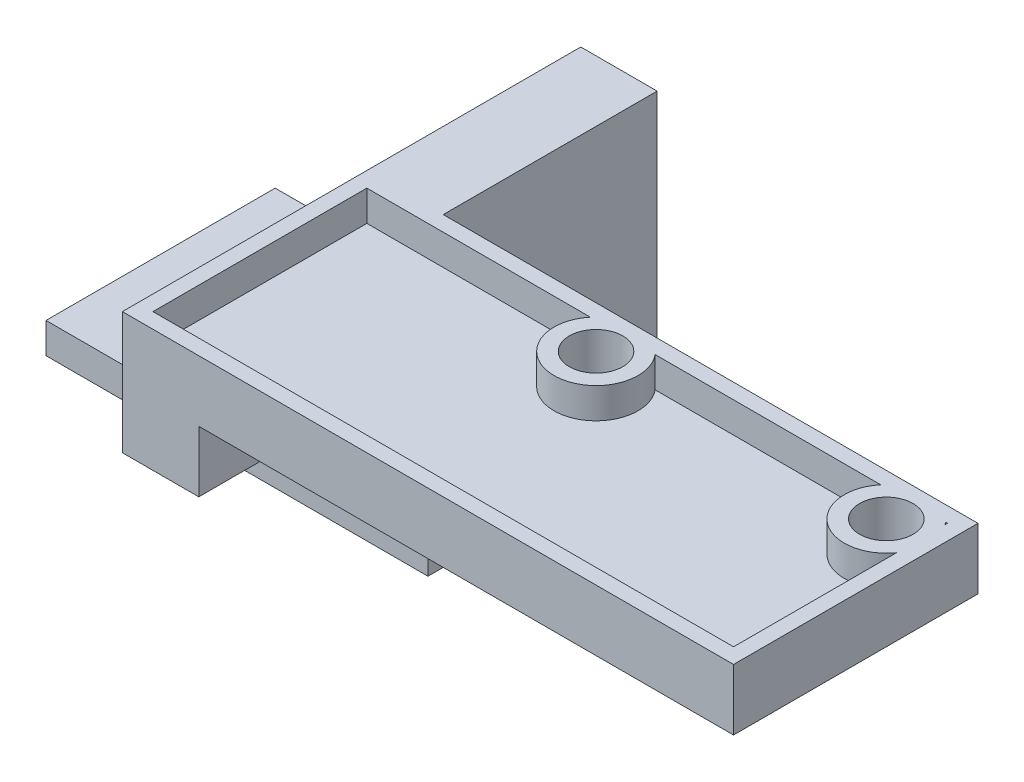
ISO-10303-21;
HEADER;
FILE_DESCRIPTION(('STEP AP214'),'2;1');
FILE_NAME('part.step','',(''),(''),'','','');
FILE_SCHEMA(('AUTOMOTIVE_DESIGN { 1 0 10303 214 1 1 1 1 }'));
ENDSEC;
DATA;
#1=APPLICATION_CONTEXT('core data for automotive mechanical design processes');
#2=APPLICATION_PROTOCOL_DEFINITION('international standard','automotive_design',2000,#1);
#3=PRODUCT_CONTEXT('',#1,'mechanical');
#4=PRODUCT('Part','Part','',(#3));
#5=PRODUCT_RELATED_PRODUCT_CATEGORY('part','',(#4));
#6=PRODUCT_DEFINITION_FORMATION('','',#4);
#7=PRODUCT_DEFINITION_CONTEXT('part definition',#1,'design');
#8=PRODUCT_DEFINITION('design','',#6,#7);
#9=PRODUCT_DEFINITION_SHAPE('','',#8);
#10=(LENGTH_UNIT() NAMED_UNIT(*) SI_UNIT(.MILLI.,.METRE.));
#11=(NAMED_UNIT(*) PLANE_ANGLE_UNIT() SI_UNIT($,.RADIAN.));
#12=(NAMED_UNIT(*) SI_UNIT($,.STERADIAN.) SOLID_ANGLE_UNIT());
#13=UNCERTAINTY_MEASURE_WITH_UNIT(LENGTH_MEASURE(1.E-05),#10,'distance_accuracy_value','');
#14=(GEOMETRIC_REPRESENTATION_CONTEXT(3) GLOBAL_UNCERTAINTY_ASSIGNED_CONTEXT((#13)) GLOBAL_UNIT_ASSIGNED_CONTEXT((#10,
#11,#12)) REPRESENTATION_CONTEXT('',''));
#15=CARTESIAN_POINT('',(0.,0.,0.));
#16=DIRECTION('',(0.,0.,1.));
#17=DIRECTION('',(1.,0.,0.));
#18=AXIS2_PLACEMENT_3D('',#15,#16,#17);
#19=CARTESIAN_POINT('',(0.,2.,-16.));
#20=DIRECTION('',(0.,0.,1.));
#21=DIRECTION('',(1.,0.,0.));
#22=AXIS2_PLACEMENT_3D('',#19,#20,#21);
#23=PLANE('',#22);
#24=DIRECTION('',(0.,-1.,0.));
#25=VECTOR('',#24,1.);
#26=CARTESIAN_POINT('',(5.00000000000001,4.,-16.));
#27=LINE('',#26,#25);
#28=CARTESIAN_POINT('',(5.00000000000001,4.,-16.));
#29=VERTEX_POINT('',#28);
#30=CARTESIAN_POINT('',(5.00000000000001,0.,-16.));
#31=VERTEX_POINT('',#30);
#32=EDGE_CURVE('E161',#29,#31,#27,.T.);
#33=ORIENTED_EDGE('',*,*,#32,.F.);
#34=DIRECTION('',(-1.,0.,0.));
#35=VECTOR('',#34,1.);
#36=CARTESIAN_POINT('',(0.,4.,-16.));
#37=LINE('',#36,#35);
#38=CARTESIAN_POINT('',(40.,4.,-16.));
#39=VERTEX_POINT('',#38);
#40=EDGE_CURVE('E420',#39,#29,#37,.T.);
#41=ORIENTED_EDGE('',*,*,#40,.F.);
#42=DIRECTION('',(0.,-1.,0.));
#43=VECTOR('',#42,1.);
#44=CARTESIAN_POINT('',(40.,2.,-16.));
#45=LINE('',#44,#43);
#46=CARTESIAN_POINT('',(40.,0.,-16.));
#47=VERTEX_POINT('',#46);
#48=EDGE_CURVE('E411',#39,#47,#45,.T.);
#49=ORIENTED_EDGE('',*,*,#48,.T.);
#50=DIRECTION('',(-1.,0.,0.));
#51=VECTOR('',#50,1.);
#52=CARTESIAN_POINT('',(0.,0.,-16.));
#53=LINE('',#52,#51);
#54=EDGE_CURVE('E414',#47,#31,#53,.T.);
#55=ORIENTED_EDGE('',*,*,#54,.T.);
#56=EDGE_LOOP('',(#33,#41,#49,#55));
#57=FACE_BOUND('',#56,.T.);
#58=ADVANCED_FACE('F135',(#57),#23,.F.);
#59=CARTESIAN_POINT('',(0.,-14.,0.));
#60=DIRECTION('',(0.,-1.,0.));
#61=DIRECTION('',(0.,0.,-1.));
#62=AXIS2_PLACEMENT_3D('',#59,#60,#61);
#63=PLANE('',#62);
#64=CARTESIAN_POINT('',(-10.,-14.,-22.5));
#65=DIRECTION('',(0.,-1.,0.));
#66=DIRECTION('',(0.,0.,-1.));
#67=AXIS2_PLACEMENT_3D('',#64,#65,#66);
#68=CIRCLE('',#67,2.6);
#69=CARTESIAN_POINT('',(-10.,-14.,-25.1));
#70=VERTEX_POINT('',#69);
#71=EDGE_CURVE('E309',#70,#70,#68,.T.);
#72=ORIENTED_EDGE('',*,*,#71,.T.);
#73=EDGE_LOOP('',(#72));
#74=FACE_BOUND('',#73,.T.);
#75=DIRECTION('',(0.,0.,1.));
#76=VECTOR('',#75,1.);
#77=CARTESIAN_POINT('',(-20.,-14.,-30.));
#78=LINE('',#77,#76);
#79=CARTESIAN_POINT('',(-20.,-14.,-30.));
#80=VERTEX_POINT('',#79);
#81=CARTESIAN_POINT('',(-20.,-14.,-15.0000572639907));
#82=VERTEX_POINT('',#81);
#83=EDGE_CURVE('E308',#80,#82,#78,.T.);
#84=ORIENTED_EDGE('',*,*,#83,.T.);
#85=DIRECTION('',(1.,0.,0.));
#86=VECTOR('',#85,1.);
#87=CARTESIAN_POINT('',(0.,-14.,-15.0000572639907));
#88=LINE('',#87,#86);
#89=CARTESIAN_POINT('',(0.,-14.,-15.0000572639907));
#90=VERTEX_POINT('',#89);
#91=EDGE_CURVE('E153',#82,#90,#88,.T.);
#92=ORIENTED_EDGE('',*,*,#91,.T.);
#93=DIRECTION('',(0.,0.,-1.));
#94=VECTOR('',#93,1.);
#95=CARTESIAN_POINT('',(0.,-14.,0.));
#96=LINE('',#95,#94);
#97=CARTESIAN_POINT('',(0.,-14.,-30.));
#98=VERTEX_POINT('',#97);
#99=EDGE_CURVE('E319',#90,#98,#96,.T.);
#100=ORIENTED_EDGE('',*,*,#99,.T.);
#101=DIRECTION('',(-1.,0.,0.));
#102=VECTOR('',#101,1.);
#103=CARTESIAN_POINT('',(0.,-14.,-30.));
#104=LINE('',#103,#102);
#105=EDGE_CURVE('E539',#98,#80,#104,.T.);
#106=ORIENTED_EDGE('',*,*,#105,.T.);
#107=EDGE_LOOP('',(#84,#92,#100,#106));
#108=FACE_BOUND('',#107,.T.);
#109=ADVANCED_FACE('F491',(#74,#108),#63,.F.);
#110=CARTESIAN_POINT('',(0.,2.,0.));
#111=DIRECTION('',(1.,0.,0.));
#112=DIRECTION('',(0.,0.,-1.));
#113=AXIS2_PLACEMENT_3D('',#110,#111,#112);
#114=PLANE('',#113);
#115=ORIENTED_EDGE('',*,*,#99,.F.);
#116=DIRECTION('',(0.,1.,0.));
#117=VECTOR('',#116,1.);
#118=CARTESIAN_POINT('',(0.,2.,-15.0000572639907));
#119=LINE('',#118,#117);
#120=CARTESIAN_POINT('',(0.,-4.,-15.0000572639907));
#121=VERTEX_POINT('',#120);
#122=EDGE_CURVE('E301',#90,#121,#119,.T.);
#123=ORIENTED_EDGE('',*,*,#122,.T.);
#124=DIRECTION('',(0.,0.,1.));
#125=VECTOR('',#124,1.);
#126=CARTESIAN_POINT('',(0.,-4.,0.));
#127=LINE('',#126,#125);
#128=CARTESIAN_POINT('',(0.,-4.,0.));
#129=VERTEX_POINT('',#128);
#130=EDGE_CURVE('E523',#121,#129,#127,.T.);
#131=ORIENTED_EDGE('',*,*,#130,.T.);
#132=DIRECTION('',(0.,-1.,0.));
#133=VECTOR('',#132,1.);
#134=CARTESIAN_POINT('',(0.,2.,0.));
#135=LINE('',#134,#133);
#136=CARTESIAN_POINT('',(0.,4.,0.));
#137=VERTEX_POINT('',#136);
#138=EDGE_CURVE('E12',#137,#129,#135,.T.);
#139=ORIENTED_EDGE('',*,*,#138,.F.);
#140=DIRECTION('',(0.,0.,1.));
#141=VECTOR('',#140,1.);
#142=CARTESIAN_POINT('',(0.,4.,0.));
#143=LINE('',#142,#141);
#144=CARTESIAN_POINT('',(0.,4.,-30.));
#145=VERTEX_POINT('',#144);
#146=EDGE_CURVE('E428',#145,#137,#143,.T.);
#147=ORIENTED_EDGE('',*,*,#146,.F.);
#148=DIRECTION('',(0.,-1.,0.));
#149=VECTOR('',#148,1.);
#150=CARTESIAN_POINT('',(0.,4.,-30.));
#151=LINE('',#150,#149);
#152=EDGE_CURVE('E532',#145,#98,#151,.T.);
#153=ORIENTED_EDGE('',*,*,#152,.T.);
#154=EDGE_LOOP('',(#115,#123,#131,#139,#147,#153));
#155=FACE_BOUND('',#154,.T.);
#156=ADVANCED_FACE('F137',(#155),#114,.F.);
#157=CARTESIAN_POINT('',(1.,4.,-15.));
#158=DIRECTION('',(0.,0.,1.));
#159=DIRECTION('',(1.,0.,0.));
#160=AXIS2_PLACEMENT_3D('',#157,#158,#159);
#161=PLANE('',#160);
#162=DIRECTION('',(0.,1.,0.));
#163=VECTOR('',#162,1.);
#164=CARTESIAN_POINT('',(38.8713203435597,-0.00200000000000027,-15.));
#165=LINE('',#164,#163);
#166=CARTESIAN_POINT('',(38.8713203435597,2.,-15.));
#167=VERTEX_POINT('',#166);
#168=CARTESIAN_POINT('',(38.8713203435597,4.,-15.));
#169=VERTEX_POINT('',#168);
#170=EDGE_CURVE('E355',#167,#169,#165,.T.);
#171=ORIENTED_EDGE('',*,*,#170,.F.);
#172=DIRECTION('',(-1.,0.,0.));
#173=VECTOR('',#172,1.);
#174=CARTESIAN_POINT('',(1.,2.,-15.));
#175=LINE('',#174,#173);
#176=CARTESIAN_POINT('',(39.,2.,-15.));
#177=VERTEX_POINT('',#176);
#178=EDGE_CURVE('E380',#177,#167,#175,.T.);
#179=ORIENTED_EDGE('',*,*,#178,.F.);
#180=DIRECTION('',(0.,-1.,0.));
#181=VECTOR('',#180,1.);
#182=CARTESIAN_POINT('',(39.,4.,-15.));
#183=LINE('',#182,#181);
#184=CARTESIAN_POINT('',(39.,4.,-15.));
#185=VERTEX_POINT('',#184);
#186=EDGE_CURVE('E435',#185,#177,#183,.T.);
#187=ORIENTED_EDGE('',*,*,#186,.F.);
#188=DIRECTION('',(-1.,0.,0.));
#189=VECTOR('',#188,1.);
#190=CARTESIAN_POINT('',(1.,4.,-15.));
#191=LINE('',#190,#189);
#192=EDGE_CURVE('E387',#185,#169,#191,.T.);
#193=ORIENTED_EDGE('',*,*,#192,.T.);
#194=EDGE_LOOP('',(#171,#179,#187,#193));
#195=FACE_BOUND('',#194,.T.);
#196=ADVANCED_FACE('F513',(#195),#161,.T.);
#197=CARTESIAN_POINT('',(39.,4.,-0.999999999999999));
#198=DIRECTION('',(-1.,0.,0.));
#199=DIRECTION('',(0.,0.,1.));
#200=AXIS2_PLACEMENT_3D('',#197,#198,#199);
#201=PLANE('',#200);
#202=DIRECTION('',(0.,1.,0.));
#203=VECTOR('',#202,1.);
#204=CARTESIAN_POINT('',(39.,-0.00200000000000027,-11.6688611699158));
#205=LINE('',#204,#203);
#206=CARTESIAN_POINT('',(39.,2.,-11.6688611699158));
#207=VERTEX_POINT('',#206);
#208=CARTESIAN_POINT('',(39.,4.,-11.6688611699158));
#209=VERTEX_POINT('',#208);
#210=EDGE_CURVE('E351',#207,#209,#205,.T.);
#211=ORIENTED_EDGE('',*,*,#210,.F.);
#212=DIRECTION('',(0.,0.,-1.));
#213=VECTOR('',#212,1.);
#214=CARTESIAN_POINT('',(39.,2.,-0.999999999999999));
#215=LINE('',#214,#213);
#216=CARTESIAN_POINT('',(39.,2.,-0.999999999999999));
#217=VERTEX_POINT('',#216);
#218=EDGE_CURVE('E398',#217,#207,#215,.T.);
#219=ORIENTED_EDGE('',*,*,#218,.F.);
#220=DIRECTION('',(0.,-1.,0.));
#221=VECTOR('',#220,1.);
#222=CARTESIAN_POINT('',(39.,4.,-0.999999999999999));
#223=LINE('',#222,#221);
#224=CARTESIAN_POINT('',(39.,4.,-0.999999999999999));
#225=VERTEX_POINT('',#224);
#226=EDGE_CURVE('E434',#225,#217,#223,.T.);
#227=ORIENTED_EDGE('',*,*,#226,.F.);
#228=DIRECTION('',(0.,0.,-1.));
#229=VECTOR('',#228,1.);
#230=CARTESIAN_POINT('',(39.,4.,-0.999999999999999));
#231=LINE('',#230,#229);
#232=EDGE_CURVE('E383',#225,#209,#231,.T.);
#233=ORIENTED_EDGE('',*,*,#232,.T.);
#234=EDGE_LOOP('',(#211,#219,#227,#233));
#235=FACE_BOUND('',#234,.T.);
#236=ADVANCED_FACE('F476',(#235),#201,.T.);
#237=CARTESIAN_POINT('',(0.,2.,0.));
#238=DIRECTION('',(0.,-1.,0.));
#239=DIRECTION('',(0.,0.,-1.));
#240=AXIS2_PLACEMENT_3D('',#237,#238,#239);
#241=PLANE('',#240);
#242=ORIENTED_EDGE('',*,*,#178,.T.);
#243=CARTESIAN_POINT('',(36.75,2.,-13.25));
#244=DIRECTION('',(0.,-1.,0.));
#245=DIRECTION('',(0.,0.,-1.));
#246=AXIS2_PLACEMENT_3D('',#243,#244,#245);
#247=CIRCLE('',#246,2.74999999999999);
#248=CARTESIAN_POINT('',(39.,2.,-14.8311388300842));
#249=VERTEX_POINT('',#248);
#250=EDGE_CURVE('E332',#249,#167,#247,.F.);
#251=ORIENTED_EDGE('',*,*,#250,.F.);
#252=EDGE_CURVE('E397',#249,#177,#215,.T.);
#253=ORIENTED_EDGE('',*,*,#252,.T.);
#254=EDGE_LOOP('',(#242,#251,#253));
#255=FACE_BOUND('',#254,.T.);
#256=ADVANCED_FACE('F511',(#255),#241,.F.);
#257=DIRECTION('',(0.,1.,0.));
#258=VECTOR('',#257,1.);
#259=CARTESIAN_POINT('',(34.6286796564404,-0.00200000000000027,-15.));
#260=LINE('',#259,#258);
#261=CARTESIAN_POINT('',(34.6286796564404,4.,-15.));
#262=VERTEX_POINT('',#261);
#263=CARTESIAN_POINT('',(34.6286796564404,2.,-15.));
#264=VERTEX_POINT('',#263);
#265=EDGE_CURVE('E353',#262,#264,#260,.F.);
#266=ORIENTED_EDGE('',*,*,#265,.F.);
#267=CARTESIAN_POINT('',(19.8713203435596,4.,-15.));
#268=VERTEX_POINT('',#267);
#269=EDGE_CURVE('E391',#262,#268,#191,.T.);
#270=ORIENTED_EDGE('',*,*,#269,.T.);
#271=DIRECTION('',(0.,1.,0.));
#272=VECTOR('',#271,1.);
#273=CARTESIAN_POINT('',(19.8713203435596,-0.00200000000000027,-15.));
#274=LINE('',#273,#272);
#275=CARTESIAN_POINT('',(19.8713203435596,2.,-15.));
#276=VERTEX_POINT('',#275);
#277=EDGE_CURVE('E369',#276,#268,#274,.T.);
#278=ORIENTED_EDGE('',*,*,#277,.F.);
#279=EDGE_CURVE('E139',#264,#276,#175,.T.);
#280=ORIENTED_EDGE('',*,*,#279,.F.);
#281=EDGE_LOOP('',(#266,#270,#278,#280));
#282=FACE_BOUND('',#281,.T.);
#283=ADVANCED_FACE('F463',(#282),#161,.T.);
#284=CARTESIAN_POINT('',(0.,2.,0.));
#285=DIRECTION('',(0.,0.,-1.));
#286=DIRECTION('',(-1.,0.,0.));
#287=AXIS2_PLACEMENT_3D('',#284,#285,#286);
#288=PLANE('',#287);
#289=ORIENTED_EDGE('',*,*,#138,.T.);
#290=DIRECTION('',(1.,0.,0.));
#291=VECTOR('',#290,1.);
#292=CARTESIAN_POINT('',(-20.,-4.,0.));
#293=LINE('',#292,#291);
#294=CARTESIAN_POINT('',(5.,-4.,0.));
#295=VERTEX_POINT('',#294);
#296=EDGE_CURVE('E302',#129,#295,#293,.T.);
#297=ORIENTED_EDGE('',*,*,#296,.T.);
#298=DIRECTION('',(0.,1.,0.));
#299=VECTOR('',#298,1.);
#300=CARTESIAN_POINT('',(5.,-16.,0.));
#301=LINE('',#300,#299);
#302=CARTESIAN_POINT('',(5.,0.,0.));
#303=VERTEX_POINT('',#302);
#304=EDGE_CURVE('E324',#295,#303,#301,.T.);
#305=ORIENTED_EDGE('',*,*,#304,.T.);
#306=DIRECTION('',(1.,0.,0.));
#307=VECTOR('',#306,1.);
#308=CARTESIAN_POINT('',(0.,0.,0.));
#309=LINE('',#308,#307);
#310=CARTESIAN_POINT('',(40.,0.,0.));
#311=VERTEX_POINT('',#310);
#312=EDGE_CURVE('E418',#303,#311,#309,.T.);
#313=ORIENTED_EDGE('',*,*,#312,.T.);
#314=DIRECTION('',(0.,-1.,0.));
#315=VECTOR('',#314,1.);
#316=CARTESIAN_POINT('',(40.,2.,0.));
#317=LINE('',#316,#315);
#318=CARTESIAN_POINT('',(40.,4.,0.));
#319=VERTEX_POINT('',#318);
#320=EDGE_CURVE('E145',#319,#311,#317,.T.);
#321=ORIENTED_EDGE('',*,*,#320,.F.);
#322=DIRECTION('',(1.,0.,0.));
#323=VECTOR('',#322,1.);
#324=CARTESIAN_POINT('',(0.,4.,0.));
#325=LINE('',#324,#323);
#326=EDGE_CURVE('E425',#137,#319,#325,.T.);
#327=ORIENTED_EDGE('',*,*,#326,.F.);
#328=EDGE_LOOP('',(#289,#297,#305,#313,#321,#327));
#329=FACE_BOUND('',#328,.T.);
#330=ADVANCED_FACE('F504',(#329),#288,.F.);
#331=CARTESIAN_POINT('',(40.,2.,0.));
#332=DIRECTION('',(-1.,0.,0.));
#333=DIRECTION('',(0.,0.,1.));
#334=AXIS2_PLACEMENT_3D('',#331,#332,#333);
#335=PLANE('',#334);
#336=DIRECTION('',(0.,0.,-1.));
#337=VECTOR('',#336,1.);
#338=CARTESIAN_POINT('',(40.,0.,0.));
#339=LINE('',#338,#337);
#340=EDGE_CURVE('E416',#311,#47,#339,.T.);
#341=ORIENTED_EDGE('',*,*,#340,.T.);
#342=ORIENTED_EDGE('',*,*,#48,.F.);
#343=DIRECTION('',(0.,0.,-1.));
#344=VECTOR('',#343,1.);
#345=CARTESIAN_POINT('',(40.,4.,0.));
#346=LINE('',#345,#344);
#347=EDGE_CURVE('E422',#319,#39,#346,.T.);
#348=ORIENTED_EDGE('',*,*,#347,.F.);
#349=ORIENTED_EDGE('',*,*,#320,.T.);
#350=EDGE_LOOP('',(#341,#342,#348,#349));
#351=FACE_BOUND('',#350,.T.);
#352=ADVANCED_FACE('F502',(#351),#335,.F.);
#353=CARTESIAN_POINT('',(0.,0.,0.));
#354=DIRECTION('',(0.,-1.,0.));
#355=DIRECTION('',(0.,0.,-1.));
#356=AXIS2_PLACEMENT_3D('',#353,#354,#355);
#357=PLANE('',#356);
#358=DIRECTION('',(0.,0.,1.));
#359=VECTOR('',#358,1.);
#360=CARTESIAN_POINT('',(5.00000000000001,0.,-16.));
#361=LINE('',#360,#359);
#362=EDGE_CURVE('E321',#31,#303,#361,.T.);
#363=ORIENTED_EDGE('',*,*,#362,.F.);
#364=ORIENTED_EDGE('',*,*,#54,.F.);
#365=ORIENTED_EDGE('',*,*,#340,.F.);
#366=ORIENTED_EDGE('',*,*,#312,.F.);
#367=EDGE_LOOP('',(#363,#364,#365,#366));
#368=FACE_BOUND('',#367,.T.);
#369=CARTESIAN_POINT('',(17.75,0.,-13.25));
#370=DIRECTION('',(0.,1.,0.));
#371=DIRECTION('',(0.,0.,1.));
#372=AXIS2_PLACEMENT_3D('',#369,#370,#371);
#373=CIRCLE('',#372,1.75);
#374=CARTESIAN_POINT('',(17.75,0.,-11.5));
#375=VERTEX_POINT('',#374);
#376=EDGE_CURVE('E329',#375,#375,#373,.T.);
#377=ORIENTED_EDGE('',*,*,#376,.T.);
#378=EDGE_LOOP('',(#377));
#379=FACE_BOUND('',#378,.T.);
#380=CARTESIAN_POINT('',(36.75,0.,-13.25));
#381=DIRECTION('',(0.,1.,0.));
#382=DIRECTION('',(0.,0.,1.));
#383=AXIS2_PLACEMENT_3D('',#380,#381,#382);
#384=CIRCLE('',#383,1.75);
#385=CARTESIAN_POINT('',(36.75,0.,-11.5));
#386=VERTEX_POINT('',#385);
#387=EDGE_CURVE('E328',#386,#386,#384,.T.);
#388=ORIENTED_EDGE('',*,*,#387,.T.);
#389=EDGE_LOOP('',(#388));
#390=FACE_BOUND('',#389,.T.);
#391=ADVANCED_FACE('F500',(#368,#379,#390),#357,.T.);
#392=CARTESIAN_POINT('',(0.,4.,0.));
#393=DIRECTION('',(0.,-1.,0.));
#394=DIRECTION('',(0.,0.,-1.));
#395=AXIS2_PLACEMENT_3D('',#392,#393,#394);
#396=PLANE('',#395);
#397=CARTESIAN_POINT('',(17.75,4.,-13.25));
#398=DIRECTION('',(0.,1.,0.));
#399=DIRECTION('',(0.,0.,1.));
#400=AXIS2_PLACEMENT_3D('',#397,#398,#399);
#401=CIRCLE('',#400,1.75);
#402=CARTESIAN_POINT('',(17.75,4.,-11.5));
#403=VERTEX_POINT('',#402);
#404=EDGE_CURVE('E333',#403,#403,#401,.T.);
#405=ORIENTED_EDGE('',*,*,#404,.F.);
#406=EDGE_LOOP('',(#405));
#407=FACE_BOUND('',#406,.T.);
#408=CARTESIAN_POINT('',(36.75,4.,-13.25));
#409=DIRECTION('',(0.,1.,0.));
#410=DIRECTION('',(0.,0.,1.));
#411=AXIS2_PLACEMENT_3D('',#408,#409,#410);
#412=CIRCLE('',#411,1.75);
#413=CARTESIAN_POINT('',(36.75,4.,-11.5));
#414=VERTEX_POINT('',#413);
#415=EDGE_CURVE('E336',#414,#414,#412,.T.);
#416=ORIENTED_EDGE('',*,*,#415,.F.);
#417=EDGE_LOOP('',(#416));
#418=FACE_BOUND('',#417,.T.);
#419=ORIENTED_EDGE('',*,*,#269,.F.);
#420=CARTESIAN_POINT('',(36.75,4.,-13.25));
#421=DIRECTION('',(0.,1.,0.));
#422=DIRECTION('',(0.,0.,1.));
#423=AXIS2_PLACEMENT_3D('',#420,#421,#422);
#424=CIRCLE('',#423,2.74999999999999);
#425=EDGE_CURVE('E345',#262,#209,#424,.T.);
#426=ORIENTED_EDGE('',*,*,#425,.T.);
#427=ORIENTED_EDGE('',*,*,#232,.F.);
#428=DIRECTION('',(1.,0.,0.));
#429=VECTOR('',#428,1.);
#430=CARTESIAN_POINT('',(1.,4.,-0.999999999999999));
#431=LINE('',#430,#429);
#432=CARTESIAN_POINT('',(1.,4.,-0.999999999999999));
#433=VERTEX_POINT('',#432);
#434=EDGE_CURVE('E379',#433,#225,#431,.T.);
#435=ORIENTED_EDGE('',*,*,#434,.F.);
#436=DIRECTION('',(0.,0.,1.));
#437=VECTOR('',#436,1.);
#438=CARTESIAN_POINT('',(1.,4.,-0.999999999999999));
#439=LINE('',#438,#437);
#440=CARTESIAN_POINT('',(1.,4.,-15.));
#441=VERTEX_POINT('',#440);
#442=EDGE_CURVE('E377',#441,#433,#439,.T.);
#443=ORIENTED_EDGE('',*,*,#442,.F.);
#444=CARTESIAN_POINT('',(15.6286796564404,4.,-15.));
#445=VERTEX_POINT('',#444);
#446=EDGE_CURVE('E386',#445,#441,#191,.T.);
#447=ORIENTED_EDGE('',*,*,#446,.F.);
#448=CARTESIAN_POINT('',(17.75,4.,-13.25));
#449=DIRECTION('',(0.,1.,0.));
#450=DIRECTION('',(0.,0.,1.));
#451=AXIS2_PLACEMENT_3D('',#448,#449,#450);
#452=CIRCLE('',#451,2.75);
#453=EDGE_CURVE('E360',#445,#268,#452,.T.);
#454=ORIENTED_EDGE('',*,*,#453,.T.);
#455=EDGE_LOOP('',(#419,#426,#427,#435,#443,#447,#454));
#456=FACE_BOUND('',#455,.T.);
#457=CARTESIAN_POINT('',(39.,4.,-14.8311388300842));
#458=VERTEX_POINT('',#457);
#459=EDGE_CURVE('E348',#458,#169,#424,.T.);
#460=ORIENTED_EDGE('',*,*,#459,.T.);
#461=ORIENTED_EDGE('',*,*,#192,.F.);
#462=EDGE_CURVE('E382',#458,#185,#231,.T.);
#463=ORIENTED_EDGE('',*,*,#462,.F.);
#464=EDGE_LOOP('',(#460,#461,#463));
#465=FACE_BOUND('',#464,.T.);
#466=ORIENTED_EDGE('',*,*,#40,.T.);
#467=DIRECTION('',(0.,0.,1.));
#468=VECTOR('',#467,1.);
#469=CARTESIAN_POINT('',(5.00000000000001,4.,-48.6815416922694));
#470=LINE('',#469,#468);
#471=CARTESIAN_POINT('',(5.00000000000001,4.,-30.));
#472=VERTEX_POINT('',#471);
#473=EDGE_CURVE('E527',#472,#29,#470,.T.);
#474=ORIENTED_EDGE('',*,*,#473,.F.);
#475=DIRECTION('',(-1.,0.,0.));
#476=VECTOR('',#475,1.);
#477=CARTESIAN_POINT('',(5.00000000000001,4.,-30.));
#478=LINE('',#477,#476);
#479=EDGE_CURVE('E533',#472,#145,#478,.T.);
#480=ORIENTED_EDGE('',*,*,#479,.T.);
#481=ORIENTED_EDGE('',*,*,#146,.T.);
#482=ORIENTED_EDGE('',*,*,#326,.T.);
#483=ORIENTED_EDGE('',*,*,#347,.T.);
#484=EDGE_LOOP('',(#466,#474,#480,#481,#482,#483));
#485=FACE_BOUND('',#484,.T.);
#486=ADVANCED_FACE('F466',(#407,#418,#456,#465,#485),#396,.F.);
#487=CARTESIAN_POINT('',(1.,4.,-0.999999999999999));
#488=DIRECTION('',(1.,0.,0.));
#489=DIRECTION('',(0.,0.,-1.));
#490=AXIS2_PLACEMENT_3D('',#487,#488,#489);
#491=PLANE('',#490);
#492=DIRECTION('',(0.,0.,1.));
#493=VECTOR('',#492,1.);
#494=CARTESIAN_POINT('',(1.,2.,-0.999999999999999));
#495=LINE('',#494,#493);
#496=CARTESIAN_POINT('',(1.,2.,-15.));
#497=VERTEX_POINT('',#496);
#498=CARTESIAN_POINT('',(1.,2.,-0.999999999999999));
#499=VERTEX_POINT('',#498);
#500=EDGE_CURVE('E374',#497,#499,#495,.T.);
#501=ORIENTED_EDGE('',*,*,#500,.F.);
#502=DIRECTION('',(0.,-1.,0.));
#503=VECTOR('',#502,1.);
#504=CARTESIAN_POINT('',(1.,4.,-15.));
#505=LINE('',#504,#503);
#506=EDGE_CURVE('E390',#441,#497,#505,.T.);
#507=ORIENTED_EDGE('',*,*,#506,.F.);
#508=ORIENTED_EDGE('',*,*,#442,.T.);
#509=DIRECTION('',(0.,-1.,0.));
#510=VECTOR('',#509,1.);
#511=CARTESIAN_POINT('',(1.,4.,-0.999999999999999));
#512=LINE('',#511,#510);
#513=EDGE_CURVE('E431',#433,#499,#512,.T.);
#514=ORIENTED_EDGE('',*,*,#513,.T.);
#515=EDGE_LOOP('',(#501,#507,#508,#514));
#516=FACE_BOUND('',#515,.T.);
#517=ADVANCED_FACE('F451',(#516),#491,.T.);
#518=CARTESIAN_POINT('',(1.,4.,-0.999999999999999));
#519=DIRECTION('',(0.,0.,-1.));
#520=DIRECTION('',(-1.,0.,0.));
#521=AXIS2_PLACEMENT_3D('',#518,#519,#520);
#522=PLANE('',#521);
#523=DIRECTION('',(1.,0.,0.));
#524=VECTOR('',#523,1.);
#525=CARTESIAN_POINT('',(1.,2.,-0.999999999999999));
#526=LINE('',#525,#524);
#527=EDGE_CURVE('E394',#499,#217,#526,.T.);
#528=ORIENTED_EDGE('',*,*,#527,.F.);
#529=ORIENTED_EDGE('',*,*,#513,.F.);
#530=ORIENTED_EDGE('',*,*,#434,.T.);
#531=ORIENTED_EDGE('',*,*,#226,.T.);
#532=EDGE_LOOP('',(#528,#529,#530,#531));
#533=FACE_BOUND('',#532,.T.);
#534=ADVANCED_FACE('F471',(#533),#522,.T.);
#535=DIRECTION('',(0.,1.,0.));
#536=VECTOR('',#535,1.);
#537=CARTESIAN_POINT('',(39.,-0.00200000000000027,-14.8311388300842));
#538=LINE('',#537,#536);
#539=EDGE_CURVE('E349',#458,#249,#538,.F.);
#540=ORIENTED_EDGE('',*,*,#539,.F.);
#541=ORIENTED_EDGE('',*,*,#462,.T.);
#542=ORIENTED_EDGE('',*,*,#186,.T.);
#543=ORIENTED_EDGE('',*,*,#252,.F.);
#544=EDGE_LOOP('',(#540,#541,#542,#543));
#545=FACE_BOUND('',#544,.T.);
#546=ADVANCED_FACE('F588',(#545),#201,.T.);
#547=DIRECTION('',(0.,1.,0.));
#548=VECTOR('',#547,1.);
#549=CARTESIAN_POINT('',(15.6286796564404,-0.00200000000000027,-15.));
#550=LINE('',#549,#548);
#551=CARTESIAN_POINT('',(15.6286796564404,2.,-15.));
#552=VERTEX_POINT('',#551);
#553=EDGE_CURVE('E363',#445,#552,#550,.F.);
#554=ORIENTED_EDGE('',*,*,#553,.F.);
#555=ORIENTED_EDGE('',*,*,#446,.T.);
#556=ORIENTED_EDGE('',*,*,#506,.T.);
#557=EDGE_CURVE('E400',#552,#497,#175,.T.);
#558=ORIENTED_EDGE('',*,*,#557,.F.);
#559=EDGE_LOOP('',(#554,#555,#556,#558));
#560=FACE_BOUND('',#559,.T.);
#561=ADVANCED_FACE('F447',(#560),#161,.T.);
#562=ORIENTED_EDGE('',*,*,#218,.T.);
#563=EDGE_CURVE('E342',#264,#207,#247,.F.);
#564=ORIENTED_EDGE('',*,*,#563,.F.);
#565=ORIENTED_EDGE('',*,*,#279,.T.);
#566=CARTESIAN_POINT('',(17.75,2.,-13.25));
#567=DIRECTION('',(0.,-1.,0.));
#568=DIRECTION('',(0.,0.,-1.));
#569=AXIS2_PLACEMENT_3D('',#566,#567,#568);
#570=CIRCLE('',#569,2.75);
#571=EDGE_CURVE('E357',#552,#276,#570,.F.);
#572=ORIENTED_EDGE('',*,*,#571,.F.);
#573=ORIENTED_EDGE('',*,*,#557,.T.);
#574=ORIENTED_EDGE('',*,*,#500,.T.);
#575=ORIENTED_EDGE('',*,*,#527,.T.);
#576=EDGE_LOOP('',(#562,#564,#565,#572,#573,#574,#575));
#577=FACE_BOUND('',#576,.T.);
#578=ADVANCED_FACE('F454',(#577),#241,.F.);
#579=CARTESIAN_POINT('',(17.75,-0.00200000000000027,-13.25));
#580=DIRECTION('',(0.,1.,0.));
#581=DIRECTION('',(0.,0.,1.));
#582=AXIS2_PLACEMENT_3D('',#579,#580,#581);
#583=CYLINDRICAL_SURFACE('',#582,2.75);
#584=ORIENTED_EDGE('',*,*,#571,.T.);
#585=ORIENTED_EDGE('',*,*,#277,.T.);
#586=ORIENTED_EDGE('',*,*,#453,.F.);
#587=ORIENTED_EDGE('',*,*,#553,.T.);
#588=EDGE_LOOP('',(#584,#585,#586,#587));
#589=FACE_BOUND('',#588,.T.);
#590=ADVANCED_FACE('F462',(#589),#583,.T.);
#591=CARTESIAN_POINT('',(36.75,-0.00200000000000027,-13.25));
#592=DIRECTION('',(0.,1.,0.));
#593=DIRECTION('',(0.,0.,1.));
#594=AXIS2_PLACEMENT_3D('',#591,#592,#593);
#595=CYLINDRICAL_SURFACE('',#594,2.74999999999999);
#596=ORIENTED_EDGE('',*,*,#425,.F.);
#597=ORIENTED_EDGE('',*,*,#265,.T.);
#598=ORIENTED_EDGE('',*,*,#563,.T.);
#599=ORIENTED_EDGE('',*,*,#210,.T.);
#600=EDGE_LOOP('',(#596,#597,#598,#599));
#601=FACE_BOUND('',#600,.T.);
#602=ADVANCED_FACE('F478',(#601),#595,.T.);
#603=ORIENTED_EDGE('',*,*,#250,.T.);
#604=ORIENTED_EDGE('',*,*,#170,.T.);
#605=ORIENTED_EDGE('',*,*,#459,.F.);
#606=ORIENTED_EDGE('',*,*,#539,.T.);
#607=EDGE_LOOP('',(#603,#604,#605,#606));
#608=FACE_BOUND('',#607,.T.);
#609=ADVANCED_FACE('F480',(#608),#595,.T.);
#610=CARTESIAN_POINT('',(36.75,0.,-13.25));
#611=DIRECTION('',(0.,1.,0.));
#612=DIRECTION('',(0.,0.,1.));
#613=AXIS2_PLACEMENT_3D('',#610,#611,#612);
#614=CYLINDRICAL_SURFACE('',#613,1.75);
#615=ORIENTED_EDGE('',*,*,#387,.F.);
#616=EDGE_LOOP('',(#615));
#617=FACE_BOUND('',#616,.T.);
#618=ORIENTED_EDGE('',*,*,#415,.T.);
#619=EDGE_LOOP('',(#618));
#620=FACE_BOUND('',#619,.T.);
#621=ADVANCED_FACE('F486',(#617,#620),#614,.F.);
#622=CARTESIAN_POINT('',(17.75,0.,-13.25));
#623=DIRECTION('',(0.,1.,0.));
#624=DIRECTION('',(0.,0.,1.));
#625=AXIS2_PLACEMENT_3D('',#622,#623,#624);
#626=CYLINDRICAL_SURFACE('',#625,1.75);
#627=ORIENTED_EDGE('',*,*,#376,.F.);
#628=EDGE_LOOP('',(#627));
#629=FACE_BOUND('',#628,.T.);
#630=ORIENTED_EDGE('',*,*,#404,.T.);
#631=EDGE_LOOP('',(#630));
#632=FACE_BOUND('',#631,.T.);
#633=ADVANCED_FACE('F557',(#629,#632),#626,.F.);
#634=CARTESIAN_POINT('',(5.00000000000001,-16.,-16.));
#635=DIRECTION('',(-1.,0.,0.));
#636=DIRECTION('',(0.,0.,1.));
#637=AXIS2_PLACEMENT_3D('',#634,#635,#636);
#638=PLANE('',#637);
#639=DIRECTION('',(0.,0.,1.));
#640=VECTOR('',#639,1.);
#641=CARTESIAN_POINT('',(5.,-4.,0.));
#642=LINE('',#641,#640);
#643=CARTESIAN_POINT('',(5.00000000000001,-4.,-15.0000572639907));
#644=VERTEX_POINT('',#643);
#645=EDGE_CURVE('E291',#644,#295,#642,.T.);
#646=ORIENTED_EDGE('',*,*,#645,.F.);
#647=DIRECTION('',(0.,1.,0.));
#648=VECTOR('',#647,1.);
#649=CARTESIAN_POINT('',(5.00000000000001,0.,-15.0000572639907));
#650=LINE('',#649,#648);
#651=CARTESIAN_POINT('',(5.00000000000001,-16.,-15.0000572639907));
#652=VERTEX_POINT('',#651);
#653=EDGE_CURVE('E748',#652,#644,#650,.T.);
#654=ORIENTED_EDGE('',*,*,#653,.F.);
#655=DIRECTION('',(0.,0.,1.));
#656=VECTOR('',#655,1.);
#657=CARTESIAN_POINT('',(5.00000000000001,-16.,-16.));
#658=LINE('',#657,#656);
#659=CARTESIAN_POINT('',(5.00000000000001,-16.,-30.));
#660=VERTEX_POINT('',#659);
#661=EDGE_CURVE('E300',#660,#652,#658,.T.);
#662=ORIENTED_EDGE('',*,*,#661,.F.);
#663=DIRECTION('',(0.,-1.,0.));
#664=VECTOR('',#663,1.);
#665=CARTESIAN_POINT('',(5.00000000000001,-14.,-30.));
#666=LINE('',#665,#664);
#667=EDGE_CURVE('E322',#472,#660,#666,.T.);
#668=ORIENTED_EDGE('',*,*,#667,.F.);
#669=ORIENTED_EDGE('',*,*,#473,.T.);
#670=ORIENTED_EDGE('',*,*,#32,.T.);
#671=ORIENTED_EDGE('',*,*,#362,.T.);
#672=ORIENTED_EDGE('',*,*,#304,.F.);
#673=EDGE_LOOP('',(#646,#654,#662,#668,#669,#670,#671,#672));
#674=FACE_BOUND('',#673,.T.);
#675=ADVANCED_FACE('F549',(#674),#638,.F.);
#676=CARTESIAN_POINT('',(0.,-16.,0.));
#677=DIRECTION('',(0.,1.,0.));
#678=DIRECTION('',(0.,0.,1.));
#679=AXIS2_PLACEMENT_3D('',#676,#677,#678);
#680=PLANE('',#679);
#681=ORIENTED_EDGE('',*,*,#661,.T.);
#682=DIRECTION('',(1.,0.,0.));
#683=VECTOR('',#682,1.);
#684=CARTESIAN_POINT('',(-20.,-16.,-15.0000572639907));
#685=LINE('',#684,#683);
#686=CARTESIAN_POINT('',(-20.,-16.,-15.0000572639907));
#687=VERTEX_POINT('',#686);
#688=EDGE_CURVE('E284',#687,#652,#685,.T.);
#689=ORIENTED_EDGE('',*,*,#688,.F.);
#690=DIRECTION('',(0.,0.,1.));
#691=VECTOR('',#690,1.);
#692=CARTESIAN_POINT('',(-20.,-16.,-30.));
#693=LINE('',#692,#691);
#694=CARTESIAN_POINT('',(-20.,-16.,-30.));
#695=VERTEX_POINT('',#694);
#696=EDGE_CURVE('E299',#695,#687,#693,.T.);
#697=ORIENTED_EDGE('',*,*,#696,.F.);
#698=DIRECTION('',(-1.,0.,0.));
#699=VECTOR('',#698,1.);
#700=CARTESIAN_POINT('',(0.,-16.,-30.));
#701=LINE('',#700,#699);
#702=EDGE_CURVE('E318',#660,#695,#701,.T.);
#703=ORIENTED_EDGE('',*,*,#702,.F.);
#704=EDGE_LOOP('',(#681,#689,#697,#703));
#705=FACE_BOUND('',#704,.T.);
#706=CARTESIAN_POINT('',(-10.,-16.,-22.5));
#707=DIRECTION('',(0.,-1.,0.));
#708=DIRECTION('',(0.,0.,-1.));
#709=AXIS2_PLACEMENT_3D('',#706,#707,#708);
#710=CIRCLE('',#709,2.6);
#711=CARTESIAN_POINT('',(-10.,-16.,-25.1));
#712=VERTEX_POINT('',#711);
#713=EDGE_CURVE('E313',#712,#712,#710,.T.);
#714=ORIENTED_EDGE('',*,*,#713,.F.);
#715=EDGE_LOOP('',(#714));
#716=FACE_BOUND('',#715,.T.);
#717=ADVANCED_FACE('F296',(#705,#716),#680,.F.);
#718=CARTESIAN_POINT('',(0.,-14.,-30.));
#719=DIRECTION('',(0.,0.,1.));
#720=DIRECTION('',(1.,0.,0.));
#721=AXIS2_PLACEMENT_3D('',#718,#719,#720);
#722=PLANE('',#721);
#723=ORIENTED_EDGE('',*,*,#702,.T.);
#724=DIRECTION('',(0.,-1.,0.));
#725=VECTOR('',#724,1.);
#726=CARTESIAN_POINT('',(-20.,-14.,-30.));
#727=LINE('',#726,#725);
#728=EDGE_CURVE('E307',#80,#695,#727,.T.);
#729=ORIENTED_EDGE('',*,*,#728,.F.);
#730=ORIENTED_EDGE('',*,*,#105,.F.);
#731=ORIENTED_EDGE('',*,*,#152,.F.);
#732=ORIENTED_EDGE('',*,*,#479,.F.);
#733=ORIENTED_EDGE('',*,*,#667,.T.);
#734=EDGE_LOOP('',(#723,#729,#730,#731,#732,#733));
#735=FACE_BOUND('',#734,.T.);
#736=ADVANCED_FACE('F548',(#735),#722,.F.);
#737=CARTESIAN_POINT('',(-10.,-14.,-22.5));
#738=DIRECTION('',(0.,-1.,0.));
#739=DIRECTION('',(0.,0.,-1.));
#740=AXIS2_PLACEMENT_3D('',#737,#738,#739);
#741=CYLINDRICAL_SURFACE('',#740,2.6);
#742=ORIENTED_EDGE('',*,*,#71,.F.);
#743=EDGE_LOOP('',(#742));
#744=FACE_BOUND('',#743,.T.);
#745=ORIENTED_EDGE('',*,*,#713,.T.);
#746=EDGE_LOOP('',(#745));
#747=FACE_BOUND('',#746,.T.);
#748=ADVANCED_FACE('F546',(#744,#747),#741,.F.);
#749=CARTESIAN_POINT('',(-20.,-14.,-30.));
#750=DIRECTION('',(1.,0.,0.));
#751=DIRECTION('',(0.,0.,-1.));
#752=AXIS2_PLACEMENT_3D('',#749,#750,#751);
#753=PLANE('',#752);
#754=ORIENTED_EDGE('',*,*,#696,.T.);
#755=DIRECTION('',(0.,1.,0.));
#756=VECTOR('',#755,1.);
#757=CARTESIAN_POINT('',(-20.,0.,-15.0000572639907));
#758=LINE('',#757,#756);
#759=EDGE_CURVE('E280',#687,#82,#758,.T.);
#760=ORIENTED_EDGE('',*,*,#759,.T.);
#761=ORIENTED_EDGE('',*,*,#83,.F.);
#762=ORIENTED_EDGE('',*,*,#728,.T.);
#763=EDGE_LOOP('',(#754,#760,#761,#762));
#764=FACE_BOUND('',#763,.T.);
#765=ADVANCED_FACE('F305',(#764),#753,.F.);
#766=CARTESIAN_POINT('',(-20.,-4.,0.));
#767=DIRECTION('',(0.,1.,0.));
#768=DIRECTION('',(0.,0.,1.));
#769=AXIS2_PLACEMENT_3D('',#766,#767,#768);
#770=PLANE('',#769);
#771=DIRECTION('',(1.,0.,0.));
#772=VECTOR('',#771,1.);
#773=CARTESIAN_POINT('',(-20.,-4.,-15.0000572639907));
#774=LINE('',#773,#772);
#775=EDGE_CURVE('E290',#121,#644,#774,.T.);
#776=ORIENTED_EDGE('',*,*,#775,.T.);
#777=ORIENTED_EDGE('',*,*,#645,.T.);
#778=ORIENTED_EDGE('',*,*,#296,.F.);
#779=ORIENTED_EDGE('',*,*,#130,.F.);
#780=EDGE_LOOP('',(#776,#777,#778,#779));
#781=FACE_BOUND('',#780,.T.);
#782=ADVANCED_FACE('F694',(#781),#770,.F.);
#783=CARTESIAN_POINT('',(-20.,0.,-15.0000572639907));
#784=DIRECTION('',(0.,0.,-1.));
#785=DIRECTION('',(-1.,0.,0.));
#786=AXIS2_PLACEMENT_3D('',#783,#784,#785);
#787=PLANE('',#786);
#788=ORIENTED_EDGE('',*,*,#759,.F.);
#789=ORIENTED_EDGE('',*,*,#688,.T.);
#790=ORIENTED_EDGE('',*,*,#653,.T.);
#791=ORIENTED_EDGE('',*,*,#775,.F.);
#792=ORIENTED_EDGE('',*,*,#122,.F.);
#793=ORIENTED_EDGE('',*,*,#91,.F.);
#794=EDGE_LOOP('',(#788,#789,#790,#791,#792,#793));
#795=FACE_BOUND('',#794,.T.);
#796=ADVANCED_FACE('F282',(#795),#787,.F.);
#797=CLOSED_SHELL('',(#58,#109,#156,#196,#236,#256,#283,#330,#352,#391,#486,#517,#534,#546,#561,
#578,#590,#602,#609,#621,#633,#675,#717,#736,#748,#765,#782,#796));
#798=MANIFOLD_SOLID_BREP('B2',#797);
#799=ADVANCED_BREP_SHAPE_REPRESENTATION('',(#18,#798),#14);
#800=SHAPE_DEFINITION_REPRESENTATION(#9,#799);
ENDSEC;
END-ISO-10303-21;
